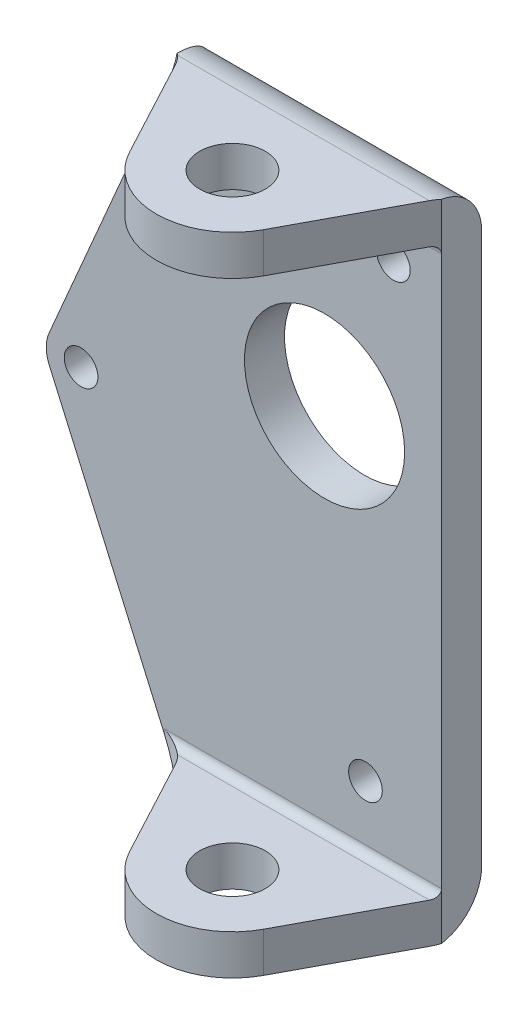
ISO-10303-21;
HEADER;
FILE_DESCRIPTION(('STEP AP214'),'2;1');
FILE_NAME('part.step','',(''),(''),'','','');
FILE_SCHEMA(('AUTOMOTIVE_DESIGN { 1 0 10303 214 1 1 1 1 }'));
ENDSEC;
DATA;
#1=APPLICATION_CONTEXT('core data for automotive mechanical design processes');
#2=APPLICATION_PROTOCOL_DEFINITION('international standard','automotive_design',2000,#1);
#3=PRODUCT_CONTEXT('',#1,'mechanical');
#4=PRODUCT('Part','Part','',(#3));
#5=PRODUCT_RELATED_PRODUCT_CATEGORY('part','',(#4));
#6=PRODUCT_DEFINITION_FORMATION('','',#4);
#7=PRODUCT_DEFINITION_CONTEXT('part definition',#1,'design');
#8=PRODUCT_DEFINITION('design','',#6,#7);
#9=PRODUCT_DEFINITION_SHAPE('','',#8);
#10=(LENGTH_UNIT() NAMED_UNIT(*) SI_UNIT(.MILLI.,.METRE.));
#11=(NAMED_UNIT(*) PLANE_ANGLE_UNIT() SI_UNIT($,.RADIAN.));
#12=(NAMED_UNIT(*) SI_UNIT($,.STERADIAN.) SOLID_ANGLE_UNIT());
#13=UNCERTAINTY_MEASURE_WITH_UNIT(LENGTH_MEASURE(1.E-05),#10,'distance_accuracy_value','');
#14=(GEOMETRIC_REPRESENTATION_CONTEXT(3) GLOBAL_UNCERTAINTY_ASSIGNED_CONTEXT((#13)) GLOBAL_UNIT_ASSIGNED_CONTEXT((#10,
#11,#12)) REPRESENTATION_CONTEXT('',''));
#15=CARTESIAN_POINT('',(0.,0.,0.));
#16=DIRECTION('',(0.,0.,1.));
#17=DIRECTION('',(1.,0.,0.));
#18=AXIS2_PLACEMENT_3D('',#15,#16,#17);
#19=CARTESIAN_POINT('',(24.76,40.32,15.));
#20=DIRECTION('',(0.,-1.,0.));
#21=DIRECTION('',(0.,0.,-1.));
#22=AXIS2_PLACEMENT_3D('',#19,#20,#21);
#23=PLANE('',#22);
#24=CARTESIAN_POINT('',(8.645,40.32,0.));
#25=DIRECTION('',(0.,1.,0.));
#26=DIRECTION('',(0.,0.,1.));
#27=AXIS2_PLACEMENT_3D('',#24,#25,#26);
#28=CIRCLE('',#27,4.1);
#29=CARTESIAN_POINT('',(8.645,40.32,4.1));
#30=VERTEX_POINT('',#29);
#31=EDGE_CURVE('E280',#30,#30,#28,.T.);
#32=ORIENTED_EDGE('',*,*,#31,.F.);
#33=EDGE_LOOP('',(#32));
#34=FACE_BOUND('',#33,.T.);
#35=DIRECTION('',(-0.471299694913525,0.,0.881973127467282));
#36=VECTOR('',#35,1.);
#37=CARTESIAN_POINT('',(24.76,40.32,-10.));
#38=LINE('',#37,#36);
#39=CARTESIAN_POINT('',(24.2256303233785,40.32,-9.00000000000001));
#40=VERTEX_POINT('',#39);
#41=CARTESIAN_POINT('',(17.0237447109392,40.32,4.47734710167849));
#42=VERTEX_POINT('',#41);
#43=EDGE_CURVE('E213',#40,#42,#38,.T.);
#44=ORIENTED_EDGE('',*,*,#43,.F.);
#45=DIRECTION('',(-1.,0.,0.));
#46=VECTOR('',#45,1.);
#47=CARTESIAN_POINT('',(24.76,40.32,-9.00000000000001));
#48=LINE('',#47,#46);
#49=CARTESIAN_POINT('',(-7.22205555456959,40.32,-9.00000000000001));
#50=VERTEX_POINT('',#49);
#51=EDGE_CURVE('E346',#40,#50,#48,.T.);
#52=ORIENTED_EDGE('',*,*,#51,.T.);
#53=CARTESIAN_POINT('',(-9.86780686563418,40.32,-6.));
#54=DIRECTION('',(0.,-1.,0.));
#55=DIRECTION('',(0.,0.,-1.));
#56=AXIS2_PLACEMENT_3D('',#53,#54,#55);
#57=CIRCLE('',#56,4.);
#58=CARTESIAN_POINT('',(-6.33991435576505,40.32,-7.8851987796541));
#59=VERTEX_POINT('',#58);
#60=EDGE_CURVE('E402',#50,#59,#57,.T.);
#61=ORIENTED_EDGE('',*,*,#60,.T.);
#62=DIRECTION('',(-0.471299694913525,0.,-0.881973127467282));
#63=VECTOR('',#62,1.);
#64=CARTESIAN_POINT('',(-7.47,40.32,-10.));
#65=LINE('',#64,#63);
#66=CARTESIAN_POINT('',(0.266255289060824,40.32,4.47734710167848));
#67=VERTEX_POINT('',#66);
#68=EDGE_CURVE('E187',#67,#59,#65,.T.);
#69=ORIENTED_EDGE('',*,*,#68,.F.);
#70=CARTESIAN_POINT('',(8.645,40.32,0.));
#71=DIRECTION('',(0.,-1.,0.));
#72=DIRECTION('',(0.,0.,1.));
#73=AXIS2_PLACEMENT_3D('',#70,#71,#72);
#74=CIRCLE('',#73,9.5);
#75=EDGE_CURVE('E216',#42,#67,#74,.T.);
#76=ORIENTED_EDGE('',*,*,#75,.F.);
#77=EDGE_LOOP('',(#44,#52,#61,#69,#76));
#78=FACE_BOUND('',#77,.T.);
#79=ADVANCED_FACE('F47',(#34,#78),#23,.F.);
#80=CARTESIAN_POINT('',(24.76,-40.32,-15.));
#81=DIRECTION('',(0.,0.,1.));
#82=DIRECTION('',(1.,0.,0.));
#83=AXIS2_PLACEMENT_3D('',#80,#81,#82);
#84=PLANE('',#83);
#85=CARTESIAN_POINT('',(10.14,10.57,-15.));
#86=DIRECTION('',(0.,0.,1.));
#87=DIRECTION('',(1.,0.,0.));
#88=AXIS2_PLACEMENT_3D('',#85,#86,#87);
#89=CIRCLE('',#88,9.99999999999999);
#90=CARTESIAN_POINT('',(20.14,10.57,-15.));
#91=VERTEX_POINT('',#90);
#92=EDGE_CURVE('E217',#91,#91,#89,.T.);
#93=ORIENTED_EDGE('',*,*,#92,.T.);
#94=EDGE_LOOP('',(#93));
#95=FACE_BOUND('',#94,.T.);
#96=CARTESIAN_POINT('',(15.25,-27.43,-15.));
#97=DIRECTION('',(0.,0.,1.));
#98=DIRECTION('',(1.,0.,0.));
#99=AXIS2_PLACEMENT_3D('',#96,#97,#98);
#100=CIRCLE('',#99,2.1);
#101=CARTESIAN_POINT('',(17.35,-27.43,-15.));
#102=VERTEX_POINT('',#101);
#103=EDGE_CURVE('E276',#102,#102,#100,.T.);
#104=ORIENTED_EDGE('',*,*,#103,.T.);
#105=EDGE_LOOP('',(#104));
#106=FACE_BOUND('',#105,.T.);
#107=CARTESIAN_POINT('',(18.74,30.57,-15.));
#108=DIRECTION('',(0.,0.,1.));
#109=DIRECTION('',(-1.,0.,0.));
#110=AXIS2_PLACEMENT_3D('',#107,#108,#109);
#111=CIRCLE('',#110,2.1);
#112=CARTESIAN_POINT('',(16.64,30.57,-15.));
#113=VERTEX_POINT('',#112);
#114=EDGE_CURVE('E289',#113,#113,#111,.T.);
#115=ORIENTED_EDGE('',*,*,#114,.T.);
#116=EDGE_LOOP('',(#115));
#117=FACE_BOUND('',#116,.T.);
#118=CARTESIAN_POINT('',(-20.26,-0.439999999999988,-15.));
#119=DIRECTION('',(0.,0.,1.));
#120=DIRECTION('',(1.,0.,0.));
#121=AXIS2_PLACEMENT_3D('',#118,#119,#120);
#122=CIRCLE('',#121,2.1);
#123=CARTESIAN_POINT('',(-18.16,-0.439999999999988,-15.));
#124=VERTEX_POINT('',#123);
#125=EDGE_CURVE('E272',#124,#124,#122,.T.);
#126=ORIENTED_EDGE('',*,*,#125,.T.);
#127=EDGE_LOOP('',(#126));
#128=FACE_BOUND('',#127,.T.);
#129=DIRECTION('',(-0.394858306806472,-0.918742029922397,0.));
#130=VECTOR('',#129,1.);
#131=CARTESIAN_POINT('',(-20.9323335022967,8.99632921433169,-15.));
#132=LINE('',#131,#130);
#133=CARTESIAN_POINT('',(-10.0486888633352,34.32,-15.));
#134=VERTEX_POINT('',#133);
#135=CARTESIAN_POINT('',(-24.2507526386401,1.27515156426447,-15.));
#136=VERTEX_POINT('',#135);
#137=EDGE_CURVE('E252',#134,#136,#132,.T.);
#138=ORIENTED_EDGE('',*,*,#137,.F.);
#139=DIRECTION('',(-1.,0.,0.));
#140=VECTOR('',#139,1.);
#141=CARTESIAN_POINT('',(24.76,34.32,-15.));
#142=LINE('',#141,#140);
#143=CARTESIAN_POINT('',(24.76,34.32,-15.));
#144=VERTEX_POINT('',#143);
#145=EDGE_CURVE('E356',#134,#144,#142,.F.);
#146=ORIENTED_EDGE('',*,*,#145,.T.);
#147=DIRECTION('',(0.,1.,0.));
#148=VECTOR('',#147,1.);
#149=CARTESIAN_POINT('',(24.76,-40.32,-15.));
#150=LINE('',#149,#148);
#151=CARTESIAN_POINT('',(24.76,-34.32,-15.));
#152=VERTEX_POINT('',#151);
#153=EDGE_CURVE('E315',#152,#144,#150,.T.);
#154=ORIENTED_EDGE('',*,*,#153,.F.);
#155=DIRECTION('',(-1.,0.,0.));
#156=VECTOR('',#155,1.);
#157=CARTESIAN_POINT('',(24.76,-34.32,-15.));
#158=LINE('',#157,#156);
#159=CARTESIAN_POINT('',(-10.1081738607853,-34.32,-15.));
#160=VERTEX_POINT('',#159);
#161=EDGE_CURVE('E352',#152,#160,#158,.T.);
#162=ORIENTED_EDGE('',*,*,#161,.T.);
#163=DIRECTION('',(-0.402505178446662,0.915417708657431,0.));
#164=VECTOR('',#163,1.);
#165=CARTESIAN_POINT('',(-21.1161042173596,-9.28465903130926,-15.));
#166=LINE('',#165,#164);
#167=CARTESIAN_POINT('',(-24.2363127377455,-2.18836738783791,-15.));
#168=VERTEX_POINT('',#167);
#169=EDGE_CURVE('E256',#160,#168,#166,.T.);
#170=ORIENTED_EDGE('',*,*,#169,.T.);
#171=CARTESIAN_POINT('',(-20.26,-0.439999999999988,-15.));
#172=DIRECTION('',(0.,0.,1.));
#173=DIRECTION('',(1.,0.,0.));
#174=AXIS2_PLACEMENT_3D('',#171,#172,#173);
#175=CIRCLE('',#174,4.34371402272433);
#176=EDGE_CURVE('E248',#136,#168,#175,.T.);
#177=ORIENTED_EDGE('',*,*,#176,.F.);
#178=EDGE_LOOP('',(#138,#146,#154,#162,#170,#177));
#179=FACE_BOUND('',#178,.T.);
#180=ADVANCED_FACE('F452',(#95,#106,#117,#128,#179),#84,.F.);
#181=CARTESIAN_POINT('',(24.76,35.32,15.));
#182=DIRECTION('',(0.,1.,0.));
#183=DIRECTION('',(0.,0.,1.));
#184=AXIS2_PLACEMENT_3D('',#181,#182,#183);
#185=PLANE('',#184);
#186=CARTESIAN_POINT('',(8.645,35.32,0.));
#187=DIRECTION('',(0.,1.,0.));
#188=DIRECTION('',(0.,0.,1.));
#189=AXIS2_PLACEMENT_3D('',#186,#187,#188);
#190=CIRCLE('',#189,4.1);
#191=CARTESIAN_POINT('',(8.645,35.32,4.1));
#192=VERTEX_POINT('',#191);
#193=EDGE_CURVE('E311',#192,#192,#190,.T.);
#194=ORIENTED_EDGE('',*,*,#193,.T.);
#195=EDGE_LOOP('',(#194));
#196=FACE_BOUND('',#195,.T.);
#197=DIRECTION('',(-0.471299694913525,0.,-0.881973127467282));
#198=VECTOR('',#197,1.);
#199=CARTESIAN_POINT('',(10.0808789076079,35.32,22.8440771912291));
#200=LINE('',#199,#198);
#201=CARTESIAN_POINT('',(0.266255289060824,35.32,4.47734710167848));
#202=VERTEX_POINT('',#201);
#203=CARTESIAN_POINT('',(-6.33991435576506,35.32,-7.8851987796541));
#204=VERTEX_POINT('',#203);
#205=EDGE_CURVE('E231',#202,#204,#200,.T.);
#206=ORIENTED_EDGE('',*,*,#205,.T.);
#207=CARTESIAN_POINT('',(-9.86780686563418,35.32,-6.));
#208=DIRECTION('',(0.,1.,0.));
#209=DIRECTION('',(0.,0.,1.));
#210=AXIS2_PLACEMENT_3D('',#207,#208,#209);
#211=CIRCLE('',#210,4.);
#212=CARTESIAN_POINT('',(-7.22205555456959,35.32,-9.));
#213=VERTEX_POINT('',#212);
#214=EDGE_CURVE('E445',#204,#213,#211,.T.);
#215=ORIENTED_EDGE('',*,*,#214,.T.);
#216=DIRECTION('',(-1.,0.,0.));
#217=VECTOR('',#216,1.);
#218=CARTESIAN_POINT('',(24.76,35.32,-9.));
#219=LINE('',#218,#217);
#220=CARTESIAN_POINT('',(24.2256303233785,35.32,-9.));
#221=VERTEX_POINT('',#220);
#222=EDGE_CURVE('E333',#213,#221,#219,.F.);
#223=ORIENTED_EDGE('',*,*,#222,.T.);
#224=DIRECTION('',(-0.471299694913525,0.,0.881973127467282));
#225=VECTOR('',#224,1.);
#226=CARTESIAN_POINT('',(14.3681583525686,35.32,9.44691493936045));
#227=LINE('',#226,#225);
#228=CARTESIAN_POINT('',(17.0237447109392,35.32,4.47734710167849));
#229=VERTEX_POINT('',#228);
#230=EDGE_CURVE('E237',#221,#229,#227,.T.);
#231=ORIENTED_EDGE('',*,*,#230,.T.);
#232=CARTESIAN_POINT('',(8.645,35.32,0.));
#233=DIRECTION('',(0.,1.,0.));
#234=DIRECTION('',(0.,0.,1.));
#235=AXIS2_PLACEMENT_3D('',#232,#233,#234);
#236=CIRCLE('',#235,9.5);
#237=EDGE_CURVE('E243',#229,#202,#236,.F.);
#238=ORIENTED_EDGE('',*,*,#237,.T.);
#239=EDGE_LOOP('',(#206,#215,#223,#231,#238));
#240=FACE_BOUND('',#239,.T.);
#241=ADVANCED_FACE('F455',(#196,#240),#185,.F.);
#242=CARTESIAN_POINT('',(24.76,35.32,-10.));
#243=DIRECTION('',(0.,0.,-1.));
#244=DIRECTION('',(0.,1.,0.));
#245=AXIS2_PLACEMENT_3D('',#242,#243,#244);
#246=PLANE('',#245);
#247=CARTESIAN_POINT('',(10.14,10.57,-10.));
#248=DIRECTION('',(0.,0.,1.));
#249=DIRECTION('',(1.,0.,0.));
#250=AXIS2_PLACEMENT_3D('',#247,#248,#249);
#251=CIRCLE('',#250,9.99999999999999);
#252=CARTESIAN_POINT('',(20.14,10.57,-10.));
#253=VERTEX_POINT('',#252);
#254=EDGE_CURVE('E531',#253,#253,#251,.T.);
#255=ORIENTED_EDGE('',*,*,#254,.F.);
#256=EDGE_LOOP('',(#255));
#257=FACE_BOUND('',#256,.T.);
#258=CARTESIAN_POINT('',(15.25,-27.43,-10.));
#259=DIRECTION('',(0.,0.,1.));
#260=DIRECTION('',(1.,0.,0.));
#261=AXIS2_PLACEMENT_3D('',#258,#259,#260);
#262=CIRCLE('',#261,2.1);
#263=CARTESIAN_POINT('',(17.35,-27.43,-10.));
#264=VERTEX_POINT('',#263);
#265=EDGE_CURVE('E281',#264,#264,#262,.T.);
#266=ORIENTED_EDGE('',*,*,#265,.F.);
#267=EDGE_LOOP('',(#266));
#268=FACE_BOUND('',#267,.T.);
#269=CARTESIAN_POINT('',(18.74,30.57,-10.));
#270=DIRECTION('',(0.,0.,1.));
#271=DIRECTION('',(-1.,0.,0.));
#272=AXIS2_PLACEMENT_3D('',#269,#270,#271);
#273=CIRCLE('',#272,2.1);
#274=CARTESIAN_POINT('',(16.64,30.57,-10.));
#275=VERTEX_POINT('',#274);
#276=EDGE_CURVE('E285',#275,#275,#273,.T.);
#277=ORIENTED_EDGE('',*,*,#276,.F.);
#278=EDGE_LOOP('',(#277));
#279=FACE_BOUND('',#278,.T.);
#280=DIRECTION('',(-1.,0.,0.));
#281=VECTOR('',#280,1.);
#282=CARTESIAN_POINT('',(-7.47,34.32,-10.));
#283=LINE('',#282,#281);
#284=CARTESIAN_POINT('',(24.76,34.32,-10.));
#285=VERTEX_POINT('',#284);
#286=CARTESIAN_POINT('',(-9.86780686563418,34.32,-10.));
#287=VERTEX_POINT('',#286);
#288=EDGE_CURVE('E330',#285,#287,#283,.T.);
#289=ORIENTED_EDGE('',*,*,#288,.T.);
#290=DIRECTION('',(0.,1.,0.));
#291=VECTOR('',#290,1.);
#292=CARTESIAN_POINT('',(-9.86780686563418,40.2360797830996,-10.));
#293=LINE('',#292,#291);
#294=CARTESIAN_POINT('',(-9.86780686563418,34.74086969143,-10.));
#295=VERTEX_POINT('',#294);
#296=EDGE_CURVE('E379',#287,#295,#293,.T.);
#297=ORIENTED_EDGE('',*,*,#296,.T.);
#298=DIRECTION('',(-0.394858306806472,-0.918742029922397,0.));
#299=VECTOR('',#298,1.);
#300=CARTESIAN_POINT('',(-20.9323335022967,8.99632921433169,-10.));
#301=LINE('',#300,#299);
#302=CARTESIAN_POINT('',(-24.2507526386401,1.27515156426447,-10.));
#303=VERTEX_POINT('',#302);
#304=EDGE_CURVE('E263',#295,#303,#301,.T.);
#305=ORIENTED_EDGE('',*,*,#304,.T.);
#306=CARTESIAN_POINT('',(-20.26,-0.439999999999988,-10.));
#307=DIRECTION('',(0.,0.,1.));
#308=DIRECTION('',(1.,0.,0.));
#309=AXIS2_PLACEMENT_3D('',#306,#307,#308);
#310=CIRCLE('',#309,4.34371402272433);
#311=CARTESIAN_POINT('',(-24.2363127377455,-2.18836738783791,-10.));
#312=VERTEX_POINT('',#311);
#313=EDGE_CURVE('E247',#303,#312,#310,.T.);
#314=ORIENTED_EDGE('',*,*,#313,.T.);
#315=DIRECTION('',(-0.402505178446662,0.915417708657431,0.));
#316=VECTOR('',#315,1.);
#317=CARTESIAN_POINT('',(-21.1161042173596,-9.28465903130926,-10.));
#318=LINE('',#317,#316);
#319=CARTESIAN_POINT('',(-9.86780686563418,-34.86666676535,-10.));
#320=VERTEX_POINT('',#319);
#321=EDGE_CURVE('E253',#320,#312,#318,.T.);
#322=ORIENTED_EDGE('',*,*,#321,.F.);
#323=DIRECTION('',(0.,1.,0.));
#324=VECTOR('',#323,1.);
#325=CARTESIAN_POINT('',(-9.86780686563418,-34.32,-10.));
#326=LINE('',#325,#324);
#327=CARTESIAN_POINT('',(-9.86780686563419,-34.32,-10.));
#328=VERTEX_POINT('',#327);
#329=EDGE_CURVE('E375',#320,#328,#326,.T.);
#330=ORIENTED_EDGE('',*,*,#329,.T.);
#331=DIRECTION('',(-1.,0.,0.));
#332=VECTOR('',#331,1.);
#333=CARTESIAN_POINT('',(24.76,-34.32,-10.));
#334=LINE('',#333,#332);
#335=CARTESIAN_POINT('',(24.76,-34.32,-10.));
#336=VERTEX_POINT('',#335);
#337=EDGE_CURVE('E326',#328,#336,#334,.F.);
#338=ORIENTED_EDGE('',*,*,#337,.T.);
#339=DIRECTION('',(0.,-1.,0.));
#340=VECTOR('',#339,1.);
#341=CARTESIAN_POINT('',(24.76,35.32,-10.));
#342=LINE('',#341,#340);
#343=EDGE_CURVE('E319',#285,#336,#342,.T.);
#344=ORIENTED_EDGE('',*,*,#343,.F.);
#345=EDGE_LOOP('',(#289,#297,#305,#314,#322,#330,#338,#344));
#346=FACE_BOUND('',#345,.T.);
#347=CARTESIAN_POINT('',(-20.26,-0.439999999999988,-10.));
#348=DIRECTION('',(0.,0.,1.));
#349=DIRECTION('',(1.,0.,0.));
#350=AXIS2_PLACEMENT_3D('',#347,#348,#349);
#351=CIRCLE('',#350,2.1);
#352=CARTESIAN_POINT('',(-18.16,-0.439999999999988,-10.));
#353=VERTEX_POINT('',#352);
#354=EDGE_CURVE('E293',#353,#353,#351,.T.);
#355=ORIENTED_EDGE('',*,*,#354,.F.);
#356=EDGE_LOOP('',(#355));
#357=FACE_BOUND('',#356,.T.);
#358=ADVANCED_FACE('F462',(#257,#268,#279,#346,#357),#246,.F.);
#359=CARTESIAN_POINT('',(24.76,-35.32,-10.));
#360=DIRECTION('',(0.,-1.,0.));
#361=DIRECTION('',(0.,0.,-1.));
#362=AXIS2_PLACEMENT_3D('',#359,#360,#361);
#363=PLANE('',#362);
#364=CARTESIAN_POINT('',(8.645,-35.32,0.));
#365=DIRECTION('',(0.,-1.,0.));
#366=DIRECTION('',(0.,0.,-1.));
#367=AXIS2_PLACEMENT_3D('',#364,#365,#366);
#368=CIRCLE('',#367,4.1);
#369=CARTESIAN_POINT('',(8.645,-35.32,-4.1));
#370=VERTEX_POINT('',#369);
#371=EDGE_CURVE('E304',#370,#370,#368,.T.);
#372=ORIENTED_EDGE('',*,*,#371,.T.);
#373=EDGE_LOOP('',(#372));
#374=FACE_BOUND('',#373,.T.);
#375=DIRECTION('',(0.471299694913525,0.,-0.881973127467282));
#376=VECTOR('',#375,1.);
#377=CARTESIAN_POINT('',(24.76,-35.32,-10.));
#378=LINE('',#377,#376);
#379=CARTESIAN_POINT('',(17.0237447109392,-35.32,4.47734710167849));
#380=VERTEX_POINT('',#379);
#381=CARTESIAN_POINT('',(24.2256303233785,-35.32,-9.00000000000001));
#382=VERTEX_POINT('',#381);
#383=EDGE_CURVE('E193',#380,#382,#378,.T.);
#384=ORIENTED_EDGE('',*,*,#383,.T.);
#385=DIRECTION('',(-1.,0.,0.));
#386=VECTOR('',#385,1.);
#387=CARTESIAN_POINT('',(-7.47,-35.32,-9.00000000000001));
#388=LINE('',#387,#386);
#389=CARTESIAN_POINT('',(-7.22205555456959,-35.32,-9.00000000000001));
#390=VERTEX_POINT('',#389);
#391=EDGE_CURVE('E336',#382,#390,#388,.T.);
#392=ORIENTED_EDGE('',*,*,#391,.T.);
#393=CARTESIAN_POINT('',(-9.86780686563418,-35.32,-6.00000000000001));
#394=DIRECTION('',(0.,-1.,0.));
#395=DIRECTION('',(0.,0.,-1.));
#396=AXIS2_PLACEMENT_3D('',#393,#394,#395);
#397=CIRCLE('',#396,4.);
#398=CARTESIAN_POINT('',(-6.33991435576506,-35.32,-7.88519877965412));
#399=VERTEX_POINT('',#398);
#400=EDGE_CURVE('E427',#390,#399,#397,.T.);
#401=ORIENTED_EDGE('',*,*,#400,.T.);
#402=DIRECTION('',(0.471299694913525,0.,0.881973127467282));
#403=VECTOR('',#402,1.);
#404=CARTESIAN_POINT('',(-0.310962739823506,-35.32,3.3971622518686));
#405=LINE('',#404,#403);
#406=CARTESIAN_POINT('',(0.266255289060824,-35.32,4.47734710167848));
#407=VERTEX_POINT('',#406);
#408=EDGE_CURVE('E225',#399,#407,#405,.T.);
#409=ORIENTED_EDGE('',*,*,#408,.T.);
#410=CARTESIAN_POINT('',(8.645,-35.32,0.));
#411=DIRECTION('',(0.,-1.,0.));
#412=DIRECTION('',(0.,0.,-1.));
#413=AXIS2_PLACEMENT_3D('',#410,#411,#412);
#414=CIRCLE('',#413,9.5);
#415=EDGE_CURVE('E240',#407,#380,#414,.F.);
#416=ORIENTED_EDGE('',*,*,#415,.T.);
#417=EDGE_LOOP('',(#384,#392,#401,#409,#416));
#418=FACE_BOUND('',#417,.T.);
#419=ADVANCED_FACE('F466',(#374,#418),#363,.F.);
#420=CARTESIAN_POINT('',(24.76,-40.32,15.));
#421=DIRECTION('',(0.,1.,0.));
#422=DIRECTION('',(0.,0.,1.));
#423=AXIS2_PLACEMENT_3D('',#420,#421,#422);
#424=PLANE('',#423);
#425=CARTESIAN_POINT('',(8.645,-40.32,0.));
#426=DIRECTION('',(0.,1.,0.));
#427=DIRECTION('',(0.,0.,1.));
#428=AXIS2_PLACEMENT_3D('',#425,#426,#427);
#429=CIRCLE('',#428,4.1);
#430=CARTESIAN_POINT('',(8.645,-40.32,4.1));
#431=VERTEX_POINT('',#430);
#432=EDGE_CURVE('E300',#431,#431,#429,.T.);
#433=ORIENTED_EDGE('',*,*,#432,.T.);
#434=EDGE_LOOP('',(#433));
#435=FACE_BOUND('',#434,.T.);
#436=DIRECTION('',(-0.471299694913525,0.,-0.881973127467282));
#437=VECTOR('',#436,1.);
#438=CARTESIAN_POINT('',(-7.47,-40.32,-10.));
#439=LINE('',#438,#437);
#440=CARTESIAN_POINT('',(0.266255289060824,-40.32,4.47734710167848));
#441=VERTEX_POINT('',#440);
#442=CARTESIAN_POINT('',(-6.33991435576506,-40.32,-7.88519877965411));
#443=VERTEX_POINT('',#442);
#444=EDGE_CURVE('E206',#441,#443,#439,.T.);
#445=ORIENTED_EDGE('',*,*,#444,.T.);
#446=CARTESIAN_POINT('',(-9.86780686563418,-40.32,-6.00000000000001));
#447=DIRECTION('',(0.,1.,0.));
#448=DIRECTION('',(0.,0.,1.));
#449=AXIS2_PLACEMENT_3D('',#446,#447,#448);
#450=CIRCLE('',#449,4.);
#451=CARTESIAN_POINT('',(-7.22205555456959,-40.32,-9.00000000000001));
#452=VERTEX_POINT('',#451);
#453=EDGE_CURVE('E424',#443,#452,#450,.T.);
#454=ORIENTED_EDGE('',*,*,#453,.T.);
#455=DIRECTION('',(-1.,0.,0.));
#456=VECTOR('',#455,1.);
#457=CARTESIAN_POINT('',(24.76,-40.32,-9.00000000000001));
#458=LINE('',#457,#456);
#459=CARTESIAN_POINT('',(24.2256303233785,-40.32,-9.));
#460=VERTEX_POINT('',#459);
#461=EDGE_CURVE('E70',#452,#460,#458,.F.);
#462=ORIENTED_EDGE('',*,*,#461,.T.);
#463=DIRECTION('',(-0.471299694913525,0.,0.881973127467282));
#464=VECTOR('',#463,1.);
#465=CARTESIAN_POINT('',(24.76,-40.32,-10.));
#466=LINE('',#465,#464);
#467=CARTESIAN_POINT('',(17.0237447109392,-40.32,4.47734710167849));
#468=VERTEX_POINT('',#467);
#469=EDGE_CURVE('E179',#460,#468,#466,.T.);
#470=ORIENTED_EDGE('',*,*,#469,.T.);
#471=CARTESIAN_POINT('',(8.645,-40.32,0.));
#472=DIRECTION('',(0.,-1.,0.));
#473=DIRECTION('',(0.,0.,1.));
#474=AXIS2_PLACEMENT_3D('',#471,#472,#473);
#475=CIRCLE('',#474,9.5);
#476=EDGE_CURVE('E184',#468,#441,#475,.T.);
#477=ORIENTED_EDGE('',*,*,#476,.T.);
#478=EDGE_LOOP('',(#445,#454,#462,#470,#477));
#479=FACE_BOUND('',#478,.T.);
#480=ADVANCED_FACE('F182',(#435,#479),#424,.F.);
#481=CARTESIAN_POINT('',(24.76,0.,0.));
#482=DIRECTION('',(-1.,0.,0.));
#483=DIRECTION('',(0.,0.,1.));
#484=AXIS2_PLACEMENT_3D('',#481,#482,#483);
#485=PLANE('',#484);
#486=ORIENTED_EDGE('',*,*,#153,.T.);
#487=CARTESIAN_POINT('',(24.76,34.32,-9.00000000000001));
#488=DIRECTION('',(-1.,0.,0.));
#489=DIRECTION('',(0.,0.,1.));
#490=AXIS2_PLACEMENT_3D('',#487,#488,#489);
#491=CIRCLE('',#490,6.);
#492=CARTESIAN_POINT('',(24.76,40.2360797830996,-10.));
#493=VERTEX_POINT('',#492);
#494=EDGE_CURVE('E362',#144,#493,#491,.F.);
#495=ORIENTED_EDGE('',*,*,#494,.T.);
#496=DIRECTION('',(0.,-1.,0.));
#497=VECTOR('',#496,1.);
#498=CARTESIAN_POINT('',(24.76,0.,-10.));
#499=LINE('',#498,#497);
#500=EDGE_CURVE('E323',#493,#285,#499,.T.);
#501=ORIENTED_EDGE('',*,*,#500,.T.);
#502=ORIENTED_EDGE('',*,*,#343,.T.);
#503=DIRECTION('',(0.,1.,0.));
#504=VECTOR('',#503,1.);
#505=CARTESIAN_POINT('',(24.76,-40.32,-10.));
#506=LINE('',#505,#504);
#507=CARTESIAN_POINT('',(24.76,-40.2360797830996,-10.));
#508=VERTEX_POINT('',#507);
#509=EDGE_CURVE('E209',#508,#336,#506,.T.);
#510=ORIENTED_EDGE('',*,*,#509,.F.);
#511=CARTESIAN_POINT('',(24.76,-34.32,-9.));
#512=DIRECTION('',(-1.,0.,0.));
#513=DIRECTION('',(0.,0.,1.));
#514=AXIS2_PLACEMENT_3D('',#511,#512,#513);
#515=CIRCLE('',#514,6.);
#516=EDGE_CURVE('E359',#508,#152,#515,.F.);
#517=ORIENTED_EDGE('',*,*,#516,.T.);
#518=EDGE_LOOP('',(#486,#495,#501,#502,#510,#517));
#519=FACE_BOUND('',#518,.T.);
#520=ADVANCED_FACE('F473',(#519),#485,.F.);
#521=CARTESIAN_POINT('',(8.645,-40.32,0.));
#522=DIRECTION('',(0.,1.,0.));
#523=DIRECTION('',(0.,0.,1.));
#524=AXIS2_PLACEMENT_3D('',#521,#522,#523);
#525=CYLINDRICAL_SURFACE('',#524,4.1);
#526=ORIENTED_EDGE('',*,*,#432,.F.);
#527=EDGE_LOOP('',(#526));
#528=FACE_BOUND('',#527,.T.);
#529=ORIENTED_EDGE('',*,*,#371,.F.);
#530=EDGE_LOOP('',(#529));
#531=FACE_BOUND('',#530,.T.);
#532=ADVANCED_FACE('F477',(#528,#531),#525,.F.);
#533=ORIENTED_EDGE('',*,*,#31,.T.);
#534=EDGE_LOOP('',(#533));
#535=FACE_BOUND('',#534,.T.);
#536=ORIENTED_EDGE('',*,*,#193,.F.);
#537=EDGE_LOOP('',(#536));
#538=FACE_BOUND('',#537,.T.);
#539=ADVANCED_FACE('F479',(#535,#538),#525,.F.);
#540=CARTESIAN_POINT('',(-20.26,-0.439999999999988,-15.));
#541=DIRECTION('',(0.,0.,1.));
#542=DIRECTION('',(1.,0.,0.));
#543=AXIS2_PLACEMENT_3D('',#540,#541,#542);
#544=CYLINDRICAL_SURFACE('',#543,2.1);
#545=ORIENTED_EDGE('',*,*,#125,.F.);
#546=EDGE_LOOP('',(#545));
#547=FACE_BOUND('',#546,.T.);
#548=ORIENTED_EDGE('',*,*,#354,.T.);
#549=EDGE_LOOP('',(#548));
#550=FACE_BOUND('',#549,.T.);
#551=ADVANCED_FACE('F482',(#547,#550),#544,.F.);
#552=CARTESIAN_POINT('',(18.74,30.57,-15.));
#553=DIRECTION('',(0.,0.,1.));
#554=DIRECTION('',(1.,0.,0.));
#555=AXIS2_PLACEMENT_3D('',#552,#553,#554);
#556=CYLINDRICAL_SURFACE('',#555,2.1);
#557=ORIENTED_EDGE('',*,*,#114,.F.);
#558=EDGE_LOOP('',(#557));
#559=FACE_BOUND('',#558,.T.);
#560=ORIENTED_EDGE('',*,*,#276,.T.);
#561=EDGE_LOOP('',(#560));
#562=FACE_BOUND('',#561,.T.);
#563=ADVANCED_FACE('F486',(#559,#562),#556,.F.);
#564=CARTESIAN_POINT('',(15.25,-27.43,-15.));
#565=DIRECTION('',(0.,0.,1.));
#566=DIRECTION('',(1.,0.,0.));
#567=AXIS2_PLACEMENT_3D('',#564,#565,#566);
#568=CYLINDRICAL_SURFACE('',#567,2.1);
#569=ORIENTED_EDGE('',*,*,#103,.F.);
#570=EDGE_LOOP('',(#569));
#571=FACE_BOUND('',#570,.T.);
#572=ORIENTED_EDGE('',*,*,#265,.T.);
#573=EDGE_LOOP('',(#572));
#574=FACE_BOUND('',#573,.T.);
#575=ADVANCED_FACE('F490',(#571,#574),#568,.F.);
#576=CARTESIAN_POINT('',(-20.26,-0.439999999999988,-15.));
#577=DIRECTION('',(0.,0.,1.));
#578=DIRECTION('',(1.,0.,0.));
#579=AXIS2_PLACEMENT_3D('',#576,#577,#578);
#580=CYLINDRICAL_SURFACE('',#579,4.34371402272433);
#581=ORIENTED_EDGE('',*,*,#313,.F.);
#582=DIRECTION('',(0.,0.,1.));
#583=VECTOR('',#582,1.);
#584=CARTESIAN_POINT('',(-24.2507526386401,1.27515156426447,-15.));
#585=LINE('',#584,#583);
#586=EDGE_CURVE('E259',#136,#303,#585,.T.);
#587=ORIENTED_EDGE('',*,*,#586,.F.);
#588=ORIENTED_EDGE('',*,*,#176,.T.);
#589=DIRECTION('',(0.,0.,1.));
#590=VECTOR('',#589,1.);
#591=CARTESIAN_POINT('',(-24.2363127377455,-2.18836738783791,-15.));
#592=LINE('',#591,#590);
#593=EDGE_CURVE('E268',#168,#312,#592,.T.);
#594=ORIENTED_EDGE('',*,*,#593,.T.);
#595=EDGE_LOOP('',(#581,#587,#588,#594));
#596=FACE_BOUND('',#595,.T.);
#597=ADVANCED_FACE('F494',(#596),#580,.T.);
#598=CARTESIAN_POINT('',(-21.1161042173596,-9.28465903130926,-15.));
#599=DIRECTION('',(0.915417708657431,0.402505178446662,0.));
#600=DIRECTION('',(-0.402505178446662,0.915417708657431,0.));
#601=AXIS2_PLACEMENT_3D('',#598,#599,#600);
#602=PLANE('',#601);
#603=ORIENTED_EDGE('',*,*,#169,.F.);
#604=CARTESIAN_POINT('',(-10.1081738607853,-34.32,-9.));
#605=DIRECTION('',(0.915417708657431,0.402505178446662,0.));
#606=DIRECTION('',(-0.402505178446662,0.915417708657431,0.));
#607=AXIS2_PLACEMENT_3D('',#604,#605,#606);
#608=ELLIPSE('',#607,6.55438489255328,6.);
#609=CARTESIAN_POINT('',(-7.47150698830815,-40.3165726558119,-9.20277175239311));
#610=VERTEX_POINT('',#609);
#611=EDGE_CURVE('E63',#160,#610,#608,.F.);
#612=ORIENTED_EDGE('',*,*,#611,.T.);
#613=CARTESIAN_POINT('',(-9.86780686563418,-34.86666676535,-6.00000000000001));
#614=DIRECTION('',(0.915417708657431,0.402505178446662,0.));
#615=DIRECTION('',(0.402505178446662,-0.915417708657431,0.));
#616=AXIS2_PLACEMENT_3D('',#613,#614,#615);
#617=ELLIPSE('',#616,9.93776034245498,4.);
#618=EDGE_CURVE('E11',#610,#320,#617,.T.);
#619=ORIENTED_EDGE('',*,*,#618,.T.);
#620=ORIENTED_EDGE('',*,*,#321,.T.);
#621=ORIENTED_EDGE('',*,*,#593,.F.);
#622=EDGE_LOOP('',(#603,#612,#619,#620,#621));
#623=FACE_BOUND('',#622,.T.);
#624=ADVANCED_FACE('F498',(#623),#602,.F.);
#625=CARTESIAN_POINT('',(-20.9323335022967,8.99632921433169,-15.));
#626=DIRECTION('',(-0.918742029922397,0.394858306806472,0.));
#627=DIRECTION('',(-0.394858306806472,-0.918742029922397,0.));
#628=AXIS2_PLACEMENT_3D('',#625,#626,#627);
#629=PLANE('',#628);
#630=ORIENTED_EDGE('',*,*,#304,.F.);
#631=CARTESIAN_POINT('',(-9.86780686563418,34.74086969143,-6.));
#632=DIRECTION('',(-0.918742029922397,0.394858306806472,0.));
#633=DIRECTION('',(-0.394858306806472,-0.918742029922397,0.));
#634=AXIS2_PLACEMENT_3D('',#631,#632,#633);
#635=ELLIPSE('',#634,10.1302161586801,4.);
#636=CARTESIAN_POINT('',(-7.47147263553457,40.3165735248897,-9.20274604951016));
#637=VERTEX_POINT('',#636);
#638=EDGE_CURVE('E389',#295,#637,#635,.F.);
#639=ORIENTED_EDGE('',*,*,#638,.T.);
#640=CARTESIAN_POINT('',(-10.0486888633352,34.32,-9.00000000000001));
#641=DIRECTION('',(-0.918742029922397,0.394858306806472,0.));
#642=DIRECTION('',(-0.394858306806472,-0.918742029922397,0.));
#643=AXIS2_PLACEMENT_3D('',#640,#641,#642);
#644=ELLIPSE('',#643,6.53066889789161,6.);
#645=EDGE_CURVE('E349',#637,#134,#644,.T.);
#646=ORIENTED_EDGE('',*,*,#645,.T.);
#647=ORIENTED_EDGE('',*,*,#137,.T.);
#648=ORIENTED_EDGE('',*,*,#586,.T.);
#649=EDGE_LOOP('',(#630,#639,#646,#647,#648));
#650=FACE_BOUND('',#649,.T.);
#651=ADVANCED_FACE('F500',(#650),#629,.T.);
#652=CARTESIAN_POINT('',(-7.47,-40.32,-10.));
#653=DIRECTION('',(0.881973127467282,0.,-0.471299694913525));
#654=DIRECTION('',(-0.471299694913525,0.,-0.881973127467282));
#655=AXIS2_PLACEMENT_3D('',#652,#653,#654);
#656=PLANE('',#655);
#657=ORIENTED_EDGE('',*,*,#68,.T.);
#658=DIRECTION('',(0.,1.,0.));
#659=VECTOR('',#658,1.);
#660=CARTESIAN_POINT('',(-6.33991435576505,34.32,-7.8851987796541));
#661=LINE('',#660,#659);
#662=EDGE_CURVE('E383',#59,#204,#661,.F.);
#663=ORIENTED_EDGE('',*,*,#662,.T.);
#664=ORIENTED_EDGE('',*,*,#205,.F.);
#665=DIRECTION('',(0.,1.,0.));
#666=VECTOR('',#665,1.);
#667=CARTESIAN_POINT('',(0.266255289060824,-40.32,4.47734710167848));
#668=LINE('',#667,#666);
#669=EDGE_CURVE('E198',#202,#67,#668,.T.);
#670=ORIENTED_EDGE('',*,*,#669,.T.);
#671=EDGE_LOOP('',(#657,#663,#664,#670));
#672=FACE_BOUND('',#671,.T.);
#673=ADVANCED_FACE('F503',(#672),#656,.F.);
#674=CARTESIAN_POINT('',(24.76,-40.32,-10.));
#675=DIRECTION('',(-0.881973127467282,0.,-0.471299694913525));
#676=DIRECTION('',(-0.471299694913525,0.,0.881973127467282));
#677=AXIS2_PLACEMENT_3D('',#674,#675,#676);
#678=PLANE('',#677);
#679=ORIENTED_EDGE('',*,*,#500,.F.);
#680=CARTESIAN_POINT('',(24.2256303233785,34.32,-9.00000000000001));
#681=DIRECTION('',(-0.881973127467282,0.,-0.471299694913525));
#682=DIRECTION('',(-0.471299694913525,0.,0.881973127467282));
#683=AXIS2_PLACEMENT_3D('',#680,#681,#682);
#684=ELLIPSE('',#683,6.80292835818014,6.);
#685=EDGE_CURVE('E365',#493,#40,#684,.F.);
#686=ORIENTED_EDGE('',*,*,#685,.T.);
#687=ORIENTED_EDGE('',*,*,#43,.T.);
#688=DIRECTION('',(0.,1.,0.));
#689=VECTOR('',#688,1.);
#690=CARTESIAN_POINT('',(17.0237447109392,-40.32,4.47734710167849));
#691=LINE('',#690,#689);
#692=EDGE_CURVE('E199',#229,#42,#691,.T.);
#693=ORIENTED_EDGE('',*,*,#692,.F.);
#694=ORIENTED_EDGE('',*,*,#230,.F.);
#695=CARTESIAN_POINT('',(24.2256303233785,34.32,-9.));
#696=DIRECTION('',(-0.881973127467282,0.,-0.471299694913525));
#697=DIRECTION('',(0.471299694913525,0.,-0.881973127467282));
#698=AXIS2_PLACEMENT_3D('',#695,#696,#697);
#699=ELLIPSE('',#698,1.13382139303002,1.);
#700=EDGE_CURVE('E339',#221,#285,#699,.T.);
#701=ORIENTED_EDGE('',*,*,#700,.T.);
#702=EDGE_LOOP('',(#679,#686,#687,#693,#694,#701));
#703=FACE_BOUND('',#702,.T.);
#704=ADVANCED_FACE('F507',(#703),#678,.F.);
#705=CARTESIAN_POINT('',(8.645,-40.32,0.));
#706=DIRECTION('',(0.,1.,0.));
#707=DIRECTION('',(0.,0.,1.));
#708=AXIS2_PLACEMENT_3D('',#705,#706,#707);
#709=CYLINDRICAL_SURFACE('',#708,9.5);
#710=ORIENTED_EDGE('',*,*,#692,.T.);
#711=ORIENTED_EDGE('',*,*,#75,.T.);
#712=ORIENTED_EDGE('',*,*,#669,.F.);
#713=ORIENTED_EDGE('',*,*,#237,.F.);
#714=EDGE_LOOP('',(#710,#711,#712,#713));
#715=FACE_BOUND('',#714,.T.);
#716=ADVANCED_FACE('F510',(#715),#709,.T.);
#717=EDGE_CURVE('E203',#441,#407,#668,.T.);
#718=ORIENTED_EDGE('',*,*,#717,.F.);
#719=ORIENTED_EDGE('',*,*,#476,.F.);
#720=EDGE_CURVE('E190',#468,#380,#691,.T.);
#721=ORIENTED_EDGE('',*,*,#720,.T.);
#722=ORIENTED_EDGE('',*,*,#415,.F.);
#723=EDGE_LOOP('',(#718,#719,#721,#722));
#724=FACE_BOUND('',#723,.T.);
#725=ADVANCED_FACE('F201',(#724),#709,.T.);
#726=ORIENTED_EDGE('',*,*,#469,.F.);
#727=CARTESIAN_POINT('',(24.2256303233785,-34.32,-9.));
#728=DIRECTION('',(-0.881973127467282,0.,-0.471299694913525));
#729=DIRECTION('',(-0.471299694913525,0.,0.881973127467282));
#730=AXIS2_PLACEMENT_3D('',#727,#728,#729);
#731=ELLIPSE('',#730,6.80292835818014,6.);
#732=EDGE_CURVE('E372',#460,#508,#731,.F.);
#733=ORIENTED_EDGE('',*,*,#732,.T.);
#734=ORIENTED_EDGE('',*,*,#509,.T.);
#735=CARTESIAN_POINT('',(24.2256303233785,-34.32,-9.00000000000001));
#736=DIRECTION('',(-0.881973127467282,0.,-0.471299694913525));
#737=DIRECTION('',(0.471299694913525,0.,-0.881973127467282));
#738=AXIS2_PLACEMENT_3D('',#735,#736,#737);
#739=ELLIPSE('',#738,1.13382139303002,1.);
#740=EDGE_CURVE('E343',#336,#382,#739,.T.);
#741=ORIENTED_EDGE('',*,*,#740,.T.);
#742=ORIENTED_EDGE('',*,*,#383,.F.);
#743=ORIENTED_EDGE('',*,*,#720,.F.);
#744=EDGE_LOOP('',(#726,#733,#734,#741,#742,#743));
#745=FACE_BOUND('',#744,.T.);
#746=ADVANCED_FACE('F191',(#745),#678,.F.);
#747=ORIENTED_EDGE('',*,*,#408,.F.);
#748=DIRECTION('',(0.,1.,0.));
#749=VECTOR('',#748,1.);
#750=CARTESIAN_POINT('',(-6.33991435576506,-40.2360797830996,-7.88519877965411));
#751=LINE('',#750,#749);
#752=EDGE_CURVE('E386',#399,#443,#751,.F.);
#753=ORIENTED_EDGE('',*,*,#752,.T.);
#754=ORIENTED_EDGE('',*,*,#444,.F.);
#755=ORIENTED_EDGE('',*,*,#717,.T.);
#756=EDGE_LOOP('',(#747,#753,#754,#755));
#757=FACE_BOUND('',#756,.T.);
#758=ADVANCED_FACE('F518',(#757),#656,.F.);
#759=CARTESIAN_POINT('',(10.14,10.57,-15.));
#760=DIRECTION('',(0.,0.,1.));
#761=DIRECTION('',(1.,0.,0.));
#762=AXIS2_PLACEMENT_3D('',#759,#760,#761);
#763=CYLINDRICAL_SURFACE('',#762,9.99999999999999);
#764=ORIENTED_EDGE('',*,*,#92,.F.);
#765=EDGE_LOOP('',(#764));
#766=FACE_BOUND('',#765,.T.);
#767=ORIENTED_EDGE('',*,*,#254,.T.);
#768=EDGE_LOOP('',(#767));
#769=FACE_BOUND('',#768,.T.);
#770=ADVANCED_FACE('F450',(#766,#769),#763,.F.);
#771=CARTESIAN_POINT('',(24.76,34.32,-9.));
#772=DIRECTION('',(1.,0.,0.));
#773=DIRECTION('',(0.,0.,-1.));
#774=AXIS2_PLACEMENT_3D('',#771,#772,#773);
#775=CYLINDRICAL_SURFACE('',#774,1.);
#776=ORIENTED_EDGE('',*,*,#700,.F.);
#777=ORIENTED_EDGE('',*,*,#222,.F.);
#778=CARTESIAN_POINT('',(-7.22205555456959,35.32,-9.));
#779=CARTESIAN_POINT('',(-7.27089043488567,35.3199777417123,-9.04308129480157));
#780=CARTESIAN_POINT('',(-7.32074057925385,35.3172186869485,-9.08491225799032));
#781=CARTESIAN_POINT('',(-7.42202843424703,35.3070039329059,-9.16580783830627));
#782=CARTESIAN_POINT('',(-7.47346291686515,35.2995572510676,-9.20487760691703));
#783=CARTESIAN_POINT('',(-7.57724464929211,35.2808143895111,-9.2798470880714));
#784=CARTESIAN_POINT('',(-7.62958113844067,35.2695498625416,-9.31576990398973));
#785=CARTESIAN_POINT('',(-7.73535265838005,35.2437499024814,-9.38476417266403));
#786=CARTESIAN_POINT('',(-7.78878839012857,35.2292123195542,-9.41783373148198));
#787=CARTESIAN_POINT('',(-7.92652553366698,35.1885283034359,-9.4986969044509));
#788=CARTESIAN_POINT('',(-8.01145724286697,35.1604233737651,-9.54444475089207));
#789=CARTESIAN_POINT('',(-8.18285775767607,35.0991077982834,-9.62906229291346));
#790=CARTESIAN_POINT('',(-8.26932709390211,35.0658953584591,-9.66792956133092));
#791=CARTESIAN_POINT('',(-8.53127869625134,34.9601045014828,-9.77483346479733));
#792=CARTESIAN_POINT('',(-8.70858141983716,34.881606085738,-9.83275455689396));
#793=CARTESIAN_POINT('',(-9.04757925580463,34.7243976240786,-9.91850936729907));
#794=CARTESIAN_POINT('',(-9.20906949590643,34.6464877906008,-9.94876568976601));
#795=CARTESIAN_POINT('',(-9.53258368541894,34.4875846353108,-9.98924683415775));
#796=CARTESIAN_POINT('',(-9.69460496293561,34.4066003400607,-9.99952627499349));
#797=CARTESIAN_POINT('',(-9.86026446361184,34.3237711978856,-9.99999466301337));
#798=CARTESIAN_POINT('',(-9.86403570464958,34.3218855772379,-9.99999999589319));
#799=CARTESIAN_POINT('',(-9.86780686563418,34.32,-10.));
#800=B_SPLINE_CURVE_WITH_KNOTS('',3,(#778,#779,#780,#781,#782,#783,#784,#785,#786,#787,#788,
#789,#790,#791,#792,#793,#794,#795,#796,#797,#798,#799),.UNSPECIFIED.,.F.,.F.,(4,2,2,2,2,2,2,2,
2,2,4),(0.,0.195194368709634,0.39001439084525,0.583257193291279,0.776627295352239,
1.07759313237772,1.37866492615878,1.98338003354342,2.52784959857839,3.07082842010451,
3.08347754086454),.UNSPECIFIED.);
#801=EDGE_CURVE('E438',#213,#287,#800,.T.);
#802=ORIENTED_EDGE('',*,*,#801,.T.);
#803=ORIENTED_EDGE('',*,*,#288,.F.);
#804=EDGE_LOOP('',(#776,#777,#802,#803));
#805=FACE_BOUND('',#804,.T.);
#806=ADVANCED_FACE('F446',(#805),#775,.F.);
#807=CARTESIAN_POINT('',(24.76,-34.32,-9.00000000000001));
#808=DIRECTION('',(1.,0.,0.));
#809=DIRECTION('',(0.,0.,-1.));
#810=AXIS2_PLACEMENT_3D('',#807,#808,#809);
#811=CYLINDRICAL_SURFACE('',#810,1.);
#812=ORIENTED_EDGE('',*,*,#740,.F.);
#813=ORIENTED_EDGE('',*,*,#337,.F.);
#814=CARTESIAN_POINT('',(-7.22205555456959,-35.32,-9.00000000000001));
#815=CARTESIAN_POINT('',(-7.27089043488568,-35.3199777417123,-9.04308129480158));
#816=CARTESIAN_POINT('',(-7.32074057925386,-35.3172186869485,-9.08491225799033));
#817=CARTESIAN_POINT('',(-7.42202843424703,-35.3070039329059,-9.16580783830628));
#818=CARTESIAN_POINT('',(-7.47346291686515,-35.2995572510676,-9.20487760691704));
#819=CARTESIAN_POINT('',(-7.57724464929212,-35.2808143895111,-9.27984708807141));
#820=CARTESIAN_POINT('',(-7.62958113844068,-35.2695498625416,-9.31576990398974));
#821=CARTESIAN_POINT('',(-7.73535265838006,-35.2437499024814,-9.38476417266404));
#822=CARTESIAN_POINT('',(-7.78878839012858,-35.2292123195542,-9.41783373148199));
#823=CARTESIAN_POINT('',(-7.92652553366698,-35.1885283034358,-9.49869690445091));
#824=CARTESIAN_POINT('',(-8.01145724286697,-35.1604233737651,-9.54444475089208));
#825=CARTESIAN_POINT('',(-8.18285775767608,-35.0991077982834,-9.62906229291347));
#826=CARTESIAN_POINT('',(-8.26932709390212,-35.0658953584591,-9.66792956133093));
#827=CARTESIAN_POINT('',(-8.53127869625135,-34.9601045014828,-9.77483346479734));
#828=CARTESIAN_POINT('',(-8.70858141983717,-34.881606085738,-9.83275455689397));
#829=CARTESIAN_POINT('',(-9.04757925580464,-34.7243976240786,-9.91850936729908));
#830=CARTESIAN_POINT('',(-9.20906949590644,-34.6464877906008,-9.94876568976603));
#831=CARTESIAN_POINT('',(-9.53258368541895,-34.4875846353108,-9.98924683415776));
#832=CARTESIAN_POINT('',(-9.69460496293561,-34.4066003400607,-9.9995262749935));
#833=CARTESIAN_POINT('',(-9.86026446361184,-34.3237711978856,-9.99999466301338));
#834=CARTESIAN_POINT('',(-9.86403570464958,-34.3218855772379,-9.99999999589319));
#835=CARTESIAN_POINT('',(-9.86780686563418,-34.32,-10.));
#836=B_SPLINE_CURVE_WITH_KNOTS('',3,(#814,#815,#816,#817,#818,#819,#820,#821,#822,#823,#824,
#825,#826,#827,#828,#829,#830,#831,#832,#833,#834,#835),.UNSPECIFIED.,.F.,.F.,(4,2,2,2,2,2,2,2,
2,2,4),(0.,0.195194368709634,0.390014390845251,0.58325719329128,0.776627295352242,
1.07759313237773,1.37866492615878,1.98338003354343,2.52784959857839,3.07082842010451,
3.08347754086454),.UNSPECIFIED.);
#837=EDGE_CURVE('E430',#328,#390,#836,.F.);
#838=ORIENTED_EDGE('',*,*,#837,.T.);
#839=ORIENTED_EDGE('',*,*,#391,.F.);
#840=EDGE_LOOP('',(#812,#813,#838,#839));
#841=FACE_BOUND('',#840,.T.);
#842=ADVANCED_FACE('F412',(#841),#811,.F.);
#843=CARTESIAN_POINT('',(24.76,34.32,-9.00000000000001));
#844=DIRECTION('',(-1.,0.,0.));
#845=DIRECTION('',(0.,0.,1.));
#846=AXIS2_PLACEMENT_3D('',#843,#844,#845);
#847=CYLINDRICAL_SURFACE('',#846,6.);
#848=ORIENTED_EDGE('',*,*,#494,.F.);
#849=ORIENTED_EDGE('',*,*,#145,.F.);
#850=ORIENTED_EDGE('',*,*,#645,.F.);
#851=CARTESIAN_POINT('',(-7.47147263553457,40.3165735248897,-9.20274604951016));
#852=CARTESIAN_POINT('',(-7.4285493969913,40.3176871591201,-9.17062955569523));
#853=CARTESIAN_POINT('',(-7.38630302095551,40.3185295158278,-9.13767580464687));
#854=CARTESIAN_POINT('',(-7.30316399396948,40.319671674197,-9.07009378814064));
#855=CARTESIAN_POINT('',(-7.26227134301694,40.3199714758594,-9.03546552268562));
#856=CARTESIAN_POINT('',(-7.22205555456959,40.32,-9.00000000000001));
#857=B_SPLINE_CURVE_WITH_KNOTS('',3,(#851,#852,#853,#854,#855,#856),.UNSPECIFIED.,.F.,.F.,(4,2,
4),(0.,0.160756772952939,0.321513545632892),.UNSPECIFIED.);
#858=EDGE_CURVE('E393',#637,#50,#857,.T.);
#859=ORIENTED_EDGE('',*,*,#858,.T.);
#860=ORIENTED_EDGE('',*,*,#51,.F.);
#861=ORIENTED_EDGE('',*,*,#685,.F.);
#862=EDGE_LOOP('',(#848,#849,#850,#859,#860,#861));
#863=FACE_BOUND('',#862,.T.);
#864=ADVANCED_FACE('F407',(#863),#847,.T.);
#865=CARTESIAN_POINT('',(24.76,-34.32,-9.));
#866=DIRECTION('',(-1.,0.,0.));
#867=DIRECTION('',(0.,0.,1.));
#868=AXIS2_PLACEMENT_3D('',#865,#866,#867);
#869=CYLINDRICAL_SURFACE('',#868,6.);
#870=ORIENTED_EDGE('',*,*,#732,.F.);
#871=ORIENTED_EDGE('',*,*,#461,.F.);
#872=CARTESIAN_POINT('',(-7.22205555456958,-40.32,-9.00000000000001));
#873=CARTESIAN_POINT('',(-7.26227671663938,-40.3199714644617,-9.03547026100157));
#874=CARTESIAN_POINT('',(-7.30317491713425,-40.3196715846774,-9.07010303752147));
#875=CARTESIAN_POINT('',(-7.3863253950448,-40.3185291366156,-9.13769362165536));
#876=CARTESIAN_POINT('',(-7.42857767246278,-40.3176865683373,-9.17065142926649));
#877=CARTESIAN_POINT('',(-7.47150698830814,-40.3165726558119,-9.20277175239311));
#878=B_SPLINE_CURVE_WITH_KNOTS('',3,(#872,#873,#874,#875,#876,#877),.UNSPECIFIED.,.F.,.F.,(4,2,
4),(0.,0.160778224488672,0.321556449250548),.UNSPECIFIED.);
#879=EDGE_CURVE('E57',#452,#610,#878,.T.);
#880=ORIENTED_EDGE('',*,*,#879,.T.);
#881=ORIENTED_EDGE('',*,*,#611,.F.);
#882=ORIENTED_EDGE('',*,*,#161,.F.);
#883=ORIENTED_EDGE('',*,*,#516,.F.);
#884=EDGE_LOOP('',(#870,#871,#880,#881,#882,#883));
#885=FACE_BOUND('',#884,.T.);
#886=ADVANCED_FACE('F411',(#885),#869,.T.);
#887=CARTESIAN_POINT('',(-9.86780686563418,35.32,-6.));
#888=DIRECTION('',(0.,-1.,0.));
#889=DIRECTION('',(0.,0.,-1.));
#890=AXIS2_PLACEMENT_3D('',#887,#888,#889);
#891=CYLINDRICAL_SURFACE('',#890,4.);
#892=ORIENTED_EDGE('',*,*,#214,.F.);
#893=ORIENTED_EDGE('',*,*,#662,.F.);
#894=ORIENTED_EDGE('',*,*,#60,.F.);
#895=ORIENTED_EDGE('',*,*,#858,.F.);
#896=ORIENTED_EDGE('',*,*,#638,.F.);
#897=ORIENTED_EDGE('',*,*,#296,.F.);
#898=ORIENTED_EDGE('',*,*,#801,.F.);
#899=EDGE_LOOP('',(#892,#893,#894,#895,#896,#897,#898));
#900=FACE_BOUND('',#899,.T.);
#901=ADVANCED_FACE('F404',(#900),#891,.F.);
#902=CARTESIAN_POINT('',(-9.86780686563418,35.32,-6.));
#903=DIRECTION('',(0.,-1.,0.));
#904=DIRECTION('',(0.,0.,-1.));
#905=AXIS2_PLACEMENT_3D('',#902,#903,#904);
#906=CYLINDRICAL_SURFACE('',#905,4.);
#907=ORIENTED_EDGE('',*,*,#453,.F.);
#908=ORIENTED_EDGE('',*,*,#752,.F.);
#909=ORIENTED_EDGE('',*,*,#400,.F.);
#910=ORIENTED_EDGE('',*,*,#837,.F.);
#911=ORIENTED_EDGE('',*,*,#329,.F.);
#912=ORIENTED_EDGE('',*,*,#618,.F.);
#913=ORIENTED_EDGE('',*,*,#879,.F.);
#914=EDGE_LOOP('',(#907,#908,#909,#910,#911,#912,#913));
#915=FACE_BOUND('',#914,.T.);
#916=ADVANCED_FACE('F49',(#915),#906,.F.);
#917=CLOSED_SHELL('',(#79,#180,#241,#358,#419,#480,#520,#532,#539,#551,#563,#575,#597,#624,#651,
#673,#704,#716,#725,#746,#758,#770,#806,#842,#864,#886,#901,#916));
#918=MANIFOLD_SOLID_BREP('B2',#917);
#919=ADVANCED_BREP_SHAPE_REPRESENTATION('',(#18,#918),#14);
#920=SHAPE_DEFINITION_REPRESENTATION(#9,#919);
ENDSEC;
END-ISO-10303-21;
